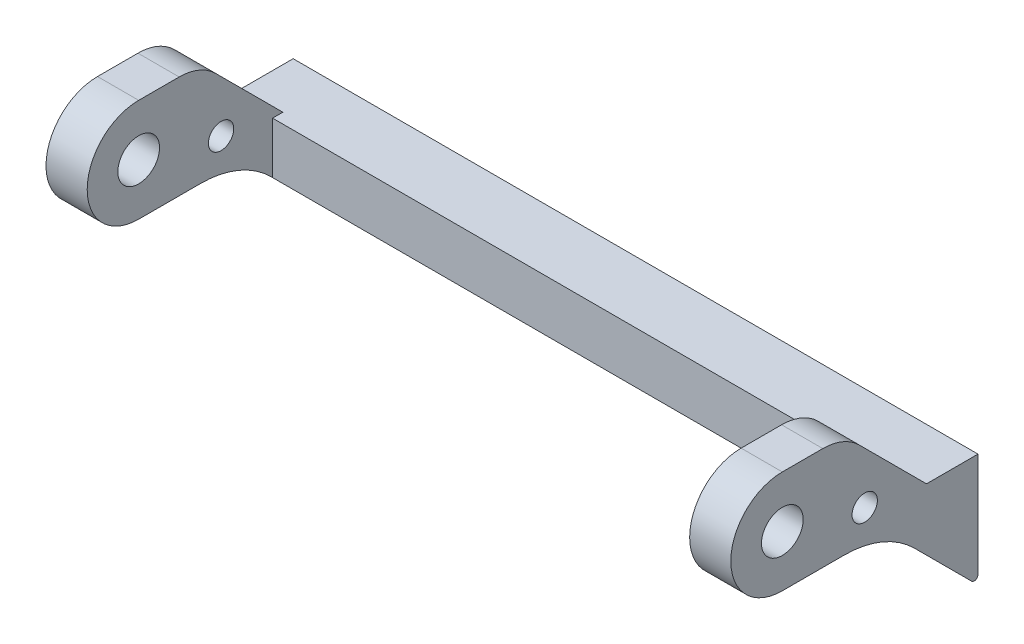
ISO-10303-21;
HEADER;
FILE_DESCRIPTION(('STEP AP214'),'2;1');
FILE_NAME('part.step','',(''),(''),'','','');
FILE_SCHEMA(('AUTOMOTIVE_DESIGN { 1 0 10303 214 1 1 1 1 }'));
ENDSEC;
DATA;
#1=APPLICATION_CONTEXT('core data for automotive mechanical design processes');
#2=APPLICATION_PROTOCOL_DEFINITION('international standard','automotive_design',2000,#1);
#3=PRODUCT_CONTEXT('',#1,'mechanical');
#4=PRODUCT('Part','Part','',(#3));
#5=PRODUCT_RELATED_PRODUCT_CATEGORY('part','',(#4));
#6=PRODUCT_DEFINITION_FORMATION('','',#4);
#7=PRODUCT_DEFINITION_CONTEXT('part definition',#1,'design');
#8=PRODUCT_DEFINITION('design','',#6,#7);
#9=PRODUCT_DEFINITION_SHAPE('','',#8);
#10=(LENGTH_UNIT() NAMED_UNIT(*) SI_UNIT(.MILLI.,.METRE.));
#11=(NAMED_UNIT(*) PLANE_ANGLE_UNIT() SI_UNIT($,.RADIAN.));
#12=(NAMED_UNIT(*) SI_UNIT($,.STERADIAN.) SOLID_ANGLE_UNIT());
#13=UNCERTAINTY_MEASURE_WITH_UNIT(LENGTH_MEASURE(1.E-05),#10,'distance_accuracy_value','');
#14=(GEOMETRIC_REPRESENTATION_CONTEXT(3) GLOBAL_UNCERTAINTY_ASSIGNED_CONTEXT((#13)) GLOBAL_UNIT_ASSIGNED_CONTEXT((#10,
#11,#12)) REPRESENTATION_CONTEXT('',''));
#15=CARTESIAN_POINT('',(0.,0.,0.));
#16=DIRECTION('',(0.,0.,1.));
#17=DIRECTION('',(1.,0.,0.));
#18=AXIS2_PLACEMENT_3D('',#15,#16,#17);
#19=CARTESIAN_POINT('',(0.,-11.1308831175457,-10.64));
#20=DIRECTION('',(1.,0.,0.));
#21=DIRECTION('',(0.,0.,-1.));
#22=AXIS2_PLACEMENT_3D('',#19,#20,#21);
#23=PLANE('',#22);
#24=CARTESIAN_POINT('',(0.,2.,8.));
#25=DIRECTION('',(1.,0.,0.));
#26=DIRECTION('',(0.,0.,-1.));
#27=AXIS2_PLACEMENT_3D('',#24,#25,#26);
#28=CIRCLE('',#27,2.025);
#29=CARTESIAN_POINT('',(0.,2.,5.975));
#30=VERTEX_POINT('',#29);
#31=EDGE_CURVE('E285',#30,#30,#28,.T.);
#32=ORIENTED_EDGE('',*,*,#31,.T.);
#33=EDGE_LOOP('',(#32));
#34=FACE_BOUND('',#33,.T.);
#35=CARTESIAN_POINT('',(0.,0.,0.));
#36=DIRECTION('',(1.,0.,0.));
#37=DIRECTION('',(0.,0.,-1.));
#38=AXIS2_PLACEMENT_3D('',#35,#36,#37);
#39=CIRCLE('',#38,1.2295);
#40=CARTESIAN_POINT('',(0.,0.,-1.2295));
#41=VERTEX_POINT('',#40);
#42=EDGE_CURVE('E287',#41,#41,#39,.T.);
#43=ORIENTED_EDGE('',*,*,#42,.T.);
#44=EDGE_LOOP('',(#43));
#45=FACE_BOUND('',#44,.T.);
#46=DIRECTION('',(0.,0.,-1.));
#47=VECTOR('',#46,1.);
#48=CARTESIAN_POINT('',(0.,-1.,-6.));
#49=LINE('',#48,#47);
#50=CARTESIAN_POINT('',(0.,-1.,-5.));
#51=VERTEX_POINT('',#50);
#52=CARTESIAN_POINT('',(0.,-1.,-6.));
#53=VERTEX_POINT('',#52);
#54=EDGE_CURVE('E275',#51,#53,#49,.T.);
#55=ORIENTED_EDGE('',*,*,#54,.F.);
#56=DIRECTION('',(0.,1.,0.));
#57=VECTOR('',#56,1.);
#58=CARTESIAN_POINT('',(0.,-1.,-5.));
#59=LINE('',#58,#57);
#60=CARTESIAN_POINT('',(0.,-6.,-5.));
#61=VERTEX_POINT('',#60);
#62=EDGE_CURVE('E74',#61,#51,#59,.T.);
#63=ORIENTED_EDGE('',*,*,#62,.F.);
#64=DIRECTION('',(0.,-0.707106781186547,-0.707106781186548));
#65=VECTOR('',#64,1.);
#66=CARTESIAN_POINT('',(0.,-11.3854415587729,-10.3854415587729));
#67=LINE('',#66,#65);
#68=CARTESIAN_POINT('',(0.,-5.82842712474619,-4.8284271247462));
#69=VERTEX_POINT('',#68);
#70=EDGE_CURVE('E300',#69,#61,#67,.T.);
#71=ORIENTED_EDGE('',*,*,#70,.F.);
#72=CARTESIAN_POINT('',(0.,-12.6568542494924,2.));
#73=DIRECTION('',(-1.,0.,0.));
#74=DIRECTION('',(0.,0.,-1.));
#75=AXIS2_PLACEMENT_3D('',#72,#73,#74);
#76=CIRCLE('',#75,9.6568542494924);
#77=CARTESIAN_POINT('',(0.,-3.,2.));
#78=VERTEX_POINT('',#77);
#79=EDGE_CURVE('E323',#78,#69,#76,.T.);
#80=ORIENTED_EDGE('',*,*,#79,.F.);
#81=DIRECTION('',(0.,0.,-1.));
#82=VECTOR('',#81,1.);
#83=CARTESIAN_POINT('',(0.,-3.,8.));
#84=LINE('',#83,#82);
#85=CARTESIAN_POINT('',(0.,-3.,8.));
#86=VERTEX_POINT('',#85);
#87=EDGE_CURVE('E321',#86,#78,#84,.T.);
#88=ORIENTED_EDGE('',*,*,#87,.F.);
#89=CARTESIAN_POINT('',(0.,2.,8.));
#90=DIRECTION('',(1.,0.,0.));
#91=DIRECTION('',(0.,0.,-1.));
#92=AXIS2_PLACEMENT_3D('',#89,#90,#91);
#93=CIRCLE('',#92,5.);
#94=CARTESIAN_POINT('',(0.,7.,8.));
#95=VERTEX_POINT('',#94);
#96=EDGE_CURVE('E317',#95,#86,#93,.T.);
#97=ORIENTED_EDGE('',*,*,#96,.F.);
#98=DIRECTION('',(0.,0.,1.));
#99=VECTOR('',#98,1.);
#100=CARTESIAN_POINT('',(0.,7.,8.));
#101=LINE('',#100,#99);
#102=CARTESIAN_POINT('',(0.,7.,4.0710678118655));
#103=VERTEX_POINT('',#102);
#104=EDGE_CURVE('E320',#103,#95,#101,.T.);
#105=ORIENTED_EDGE('',*,*,#104,.F.);
#106=CARTESIAN_POINT('',(0.,2.,4.0710678118655));
#107=DIRECTION('',(1.,0.,0.));
#108=DIRECTION('',(0.,0.,-1.));
#109=AXIS2_PLACEMENT_3D('',#106,#107,#108);
#110=CIRCLE('',#109,5.00000000000001);
#111=CARTESIAN_POINT('',(0.,5.53553390593274,0.535533905932757));
#112=VERTEX_POINT('',#111);
#113=EDGE_CURVE('E312',#112,#103,#110,.T.);
#114=ORIENTED_EDGE('',*,*,#113,.F.);
#115=DIRECTION('',(0.,0.707106781186547,0.707106781186548));
#116=VECTOR('',#115,1.);
#117=CARTESIAN_POINT('',(0.,5.53553390593275,0.535533905932752));
#118=LINE('',#117,#116);
#119=EDGE_CURVE('E295',#53,#112,#118,.T.);
#120=ORIENTED_EDGE('',*,*,#119,.F.);
#121=EDGE_LOOP('',(#55,#63,#71,#80,#88,#97,#105,#114,#120));
#122=FACE_BOUND('',#121,.T.);
#123=ADVANCED_FACE('F51',(#34,#45,#122),#23,.F.);
#124=CARTESIAN_POINT('',(4.,-11.1308831175457,-10.64));
#125=DIRECTION('',(1.,0.,0.));
#126=DIRECTION('',(0.,0.,-1.));
#127=AXIS2_PLACEMENT_3D('',#124,#125,#126);
#128=PLANE('',#127);
#129=CARTESIAN_POINT('',(4.,0.,0.));
#130=DIRECTION('',(1.,0.,0.));
#131=DIRECTION('',(0.,0.,-1.));
#132=AXIS2_PLACEMENT_3D('',#129,#130,#131);
#133=CIRCLE('',#132,1.2295);
#134=CARTESIAN_POINT('',(4.,0.,-1.2295));
#135=VERTEX_POINT('',#134);
#136=EDGE_CURVE('E289',#135,#135,#133,.T.);
#137=ORIENTED_EDGE('',*,*,#136,.F.);
#138=EDGE_LOOP('',(#137));
#139=FACE_BOUND('',#138,.T.);
#140=CARTESIAN_POINT('',(4.,-11.1308831175457,-10.64));
#141=DIRECTION('',(1.,0.,0.));
#142=DIRECTION('',(0.,0.,-1.));
#143=AXIS2_PLACEMENT_3D('',#140,#141,#142);
#144=CIRCLE('',#143,0.359999999999993);
#145=CARTESIAN_POINT('',(4.,-11.3854415587729,-10.3854415587729));
#146=VERTEX_POINT('',#145);
#147=CARTESIAN_POINT('',(4.,-11.1308831175457,-11.));
#148=VERTEX_POINT('',#147);
#149=EDGE_CURVE('E192',#146,#148,#144,.T.);
#150=ORIENTED_EDGE('',*,*,#149,.T.);
#151=DIRECTION('',(0.,1.,0.));
#152=VECTOR('',#151,1.);
#153=CARTESIAN_POINT('',(4.,-11.1308831175457,-11.));
#154=LINE('',#153,#152);
#155=CARTESIAN_POINT('',(4.,-1.,-11.));
#156=VERTEX_POINT('',#155);
#157=EDGE_CURVE('E297',#148,#156,#154,.T.);
#158=ORIENTED_EDGE('',*,*,#157,.T.);
#159=DIRECTION('',(0.,0.,1.));
#160=VECTOR('',#159,1.);
#161=CARTESIAN_POINT('',(4.,-1.,-11.));
#162=LINE('',#161,#160);
#163=CARTESIAN_POINT('',(4.,-1.,-6.));
#164=VERTEX_POINT('',#163);
#165=EDGE_CURVE('E299',#156,#164,#162,.T.);
#166=ORIENTED_EDGE('',*,*,#165,.T.);
#167=DIRECTION('',(0.,0.707106781186547,0.707106781186548));
#168=VECTOR('',#167,1.);
#169=CARTESIAN_POINT('',(4.,5.53553390593275,0.535533905932752));
#170=LINE('',#169,#168);
#171=CARTESIAN_POINT('',(4.,5.53553390593274,0.535533905932757));
#172=VERTEX_POINT('',#171);
#173=EDGE_CURVE('E302',#164,#172,#170,.T.);
#174=ORIENTED_EDGE('',*,*,#173,.T.);
#175=CARTESIAN_POINT('',(4.,2.,4.0710678118655));
#176=DIRECTION('',(1.,0.,0.));
#177=DIRECTION('',(0.,0.,-1.));
#178=AXIS2_PLACEMENT_3D('',#175,#176,#177);
#179=CIRCLE('',#178,5.00000000000001);
#180=CARTESIAN_POINT('',(4.,7.,4.0710678118655));
#181=VERTEX_POINT('',#180);
#182=EDGE_CURVE('E303',#172,#181,#179,.T.);
#183=ORIENTED_EDGE('',*,*,#182,.T.);
#184=DIRECTION('',(0.,0.,1.));
#185=VECTOR('',#184,1.);
#186=CARTESIAN_POINT('',(4.,7.,8.));
#187=LINE('',#186,#185);
#188=CARTESIAN_POINT('',(4.,7.,8.));
#189=VERTEX_POINT('',#188);
#190=EDGE_CURVE('E301',#181,#189,#187,.T.);
#191=ORIENTED_EDGE('',*,*,#190,.T.);
#192=CARTESIAN_POINT('',(4.,2.,8.));
#193=DIRECTION('',(1.,0.,0.));
#194=DIRECTION('',(0.,0.,-1.));
#195=AXIS2_PLACEMENT_3D('',#192,#193,#194);
#196=CIRCLE('',#195,5.);
#197=CARTESIAN_POINT('',(4.,-3.,8.));
#198=VERTEX_POINT('',#197);
#199=EDGE_CURVE('E307',#189,#198,#196,.T.);
#200=ORIENTED_EDGE('',*,*,#199,.T.);
#201=DIRECTION('',(0.,0.,-1.));
#202=VECTOR('',#201,1.);
#203=CARTESIAN_POINT('',(4.,-3.,8.));
#204=LINE('',#203,#202);
#205=CARTESIAN_POINT('',(4.,-3.,2.));
#206=VERTEX_POINT('',#205);
#207=EDGE_CURVE('E310',#198,#206,#204,.T.);
#208=ORIENTED_EDGE('',*,*,#207,.T.);
#209=CARTESIAN_POINT('',(4.,-12.6568542494924,2.));
#210=DIRECTION('',(-1.,0.,0.));
#211=DIRECTION('',(0.,0.,-1.));
#212=AXIS2_PLACEMENT_3D('',#209,#210,#211);
#213=CIRCLE('',#212,9.6568542494924);
#214=CARTESIAN_POINT('',(4.,-5.82842712474619,-4.8284271247462));
#215=VERTEX_POINT('',#214);
#216=EDGE_CURVE('E313',#206,#215,#213,.T.);
#217=ORIENTED_EDGE('',*,*,#216,.T.);
#218=DIRECTION('',(0.,-0.707106781186547,-0.707106781186548));
#219=VECTOR('',#218,1.);
#220=CARTESIAN_POINT('',(4.,-11.3854415587729,-10.3854415587729));
#221=LINE('',#220,#219);
#222=EDGE_CURVE('E198',#215,#146,#221,.T.);
#223=ORIENTED_EDGE('',*,*,#222,.T.);
#224=EDGE_LOOP('',(#150,#158,#166,#174,#183,#191,#200,#208,#217,#223));
#225=FACE_BOUND('',#224,.T.);
#226=CARTESIAN_POINT('',(4.,2.,8.));
#227=DIRECTION('',(1.,0.,0.));
#228=DIRECTION('',(0.,0.,-1.));
#229=AXIS2_PLACEMENT_3D('',#226,#227,#228);
#230=CIRCLE('',#229,2.025);
#231=CARTESIAN_POINT('',(4.,2.,5.975));
#232=VERTEX_POINT('',#231);
#233=EDGE_CURVE('E283',#232,#232,#230,.T.);
#234=ORIENTED_EDGE('',*,*,#233,.F.);
#235=EDGE_LOOP('',(#234));
#236=FACE_BOUND('',#235,.T.);
#237=ADVANCED_FACE('F354',(#139,#225,#236),#128,.T.);
#238=CARTESIAN_POINT('',(4.,-11.1308831175457,-10.64));
#239=DIRECTION('',(-1.,0.,0.));
#240=DIRECTION('',(0.,0.,1.));
#241=AXIS2_PLACEMENT_3D('',#238,#239,#240);
#242=CYLINDRICAL_SURFACE('',#241,0.359999999999993);
#243=DIRECTION('',(-1.,0.,0.));
#244=VECTOR('',#243,1.);
#245=CARTESIAN_POINT('',(4.,-11.3854415587729,-10.3854415587729));
#246=LINE('',#245,#244);
#247=CARTESIAN_POINT('',(-62.5,-11.3854415587729,-10.3854415587729));
#248=VERTEX_POINT('',#247);
#249=EDGE_CURVE('E183',#146,#248,#246,.T.);
#250=ORIENTED_EDGE('',*,*,#249,.T.);
#251=CARTESIAN_POINT('',(-62.5,-11.1308831175457,-10.64));
#252=DIRECTION('',(1.,0.,0.));
#253=DIRECTION('',(0.,0.,-1.));
#254=AXIS2_PLACEMENT_3D('',#251,#252,#253);
#255=CIRCLE('',#254,0.359999999999993);
#256=CARTESIAN_POINT('',(-62.5,-11.1308831175457,-11.));
#257=VERTEX_POINT('',#256);
#258=EDGE_CURVE('E188',#248,#257,#255,.T.);
#259=ORIENTED_EDGE('',*,*,#258,.T.);
#260=DIRECTION('',(-1.,0.,0.));
#261=VECTOR('',#260,1.);
#262=CARTESIAN_POINT('',(4.,-11.1308831175457,-11.));
#263=LINE('',#262,#261);
#264=EDGE_CURVE('E13',#148,#257,#263,.T.);
#265=ORIENTED_EDGE('',*,*,#264,.F.);
#266=ORIENTED_EDGE('',*,*,#149,.F.);
#267=EDGE_LOOP('',(#250,#259,#265,#266));
#268=FACE_BOUND('',#267,.T.);
#269=ADVANCED_FACE('F52',(#268),#242,.T.);
#270=CARTESIAN_POINT('',(4.,-11.1308831175457,-11.));
#271=DIRECTION('',(0.,0.,1.));
#272=DIRECTION('',(1.,0.,0.));
#273=AXIS2_PLACEMENT_3D('',#270,#271,#272);
#274=PLANE('',#273);
#275=ORIENTED_EDGE('',*,*,#264,.T.);
#276=DIRECTION('',(0.,1.,0.));
#277=VECTOR('',#276,1.);
#278=CARTESIAN_POINT('',(-62.5,-11.1308831175457,-11.));
#279=LINE('',#278,#277);
#280=CARTESIAN_POINT('',(-62.5,-1.,-11.));
#281=VERTEX_POINT('',#280);
#282=EDGE_CURVE('E206',#257,#281,#279,.T.);
#283=ORIENTED_EDGE('',*,*,#282,.T.);
#284=DIRECTION('',(-1.,0.,0.));
#285=VECTOR('',#284,1.);
#286=CARTESIAN_POINT('',(4.,-1.,-11.));
#287=LINE('',#286,#285);
#288=EDGE_CURVE('E56',#156,#281,#287,.T.);
#289=ORIENTED_EDGE('',*,*,#288,.F.);
#290=ORIENTED_EDGE('',*,*,#157,.F.);
#291=EDGE_LOOP('',(#275,#283,#289,#290));
#292=FACE_BOUND('',#291,.T.);
#293=ADVANCED_FACE('F355',(#292),#274,.F.);
#294=CARTESIAN_POINT('',(4.,-1.,-11.));
#295=DIRECTION('',(0.,-1.,0.));
#296=DIRECTION('',(0.,0.,-1.));
#297=AXIS2_PLACEMENT_3D('',#294,#295,#296);
#298=PLANE('',#297);
#299=ORIENTED_EDGE('',*,*,#288,.T.);
#300=DIRECTION('',(0.,0.,1.));
#301=VECTOR('',#300,1.);
#302=CARTESIAN_POINT('',(-62.5,-1.,-11.));
#303=LINE('',#302,#301);
#304=CARTESIAN_POINT('',(-62.5,-1.,-6.));
#305=VERTEX_POINT('',#304);
#306=EDGE_CURVE('E235',#281,#305,#303,.T.);
#307=ORIENTED_EDGE('',*,*,#306,.T.);
#308=DIRECTION('',(1.,0.,0.));
#309=VECTOR('',#308,1.);
#310=CARTESIAN_POINT('',(-62.5,-1.,-6.));
#311=LINE('',#310,#309);
#312=CARTESIAN_POINT('',(-58.5,-1.,-6.));
#313=VERTEX_POINT('',#312);
#314=EDGE_CURVE('E237',#305,#313,#311,.T.);
#315=ORIENTED_EDGE('',*,*,#314,.T.);
#316=DIRECTION('',(0.,0.,-1.));
#317=VECTOR('',#316,1.);
#318=CARTESIAN_POINT('',(-58.5,-1.,-6.));
#319=LINE('',#318,#317);
#320=CARTESIAN_POINT('',(-58.5,-1.,-5.));
#321=VERTEX_POINT('',#320);
#322=EDGE_CURVE('E67',#321,#313,#319,.T.);
#323=ORIENTED_EDGE('',*,*,#322,.F.);
#324=DIRECTION('',(1.,0.,0.));
#325=VECTOR('',#324,1.);
#326=CARTESIAN_POINT('',(-29.25,-1.,-5.));
#327=LINE('',#326,#325);
#328=EDGE_CURVE('E277',#321,#51,#327,.T.);
#329=ORIENTED_EDGE('',*,*,#328,.T.);
#330=ORIENTED_EDGE('',*,*,#54,.T.);
#331=DIRECTION('',(-1.,0.,0.));
#332=VECTOR('',#331,1.);
#333=CARTESIAN_POINT('',(4.,-1.,-6.));
#334=LINE('',#333,#332);
#335=EDGE_CURVE('E343',#164,#53,#334,.T.);
#336=ORIENTED_EDGE('',*,*,#335,.F.);
#337=ORIENTED_EDGE('',*,*,#165,.F.);
#338=EDGE_LOOP('',(#299,#307,#315,#323,#329,#330,#336,#337));
#339=FACE_BOUND('',#338,.T.);
#340=ADVANCED_FACE('F350',(#339),#298,.F.);
#341=CARTESIAN_POINT('',(4.,5.53553390593275,0.535533905932752));
#342=DIRECTION('',(0.,-0.707106781186548,0.707106781186547));
#343=DIRECTION('',(0.,-0.707106781186547,-0.707106781186548));
#344=AXIS2_PLACEMENT_3D('',#341,#342,#343);
#345=PLANE('',#344);
#346=ORIENTED_EDGE('',*,*,#119,.T.);
#347=DIRECTION('',(-1.,0.,0.));
#348=VECTOR('',#347,1.);
#349=CARTESIAN_POINT('',(4.,5.53553390593274,0.535533905932757));
#350=LINE('',#349,#348);
#351=EDGE_CURVE('E336',#172,#112,#350,.T.);
#352=ORIENTED_EDGE('',*,*,#351,.F.);
#353=ORIENTED_EDGE('',*,*,#173,.F.);
#354=ORIENTED_EDGE('',*,*,#335,.T.);
#355=EDGE_LOOP('',(#346,#352,#353,#354));
#356=FACE_BOUND('',#355,.T.);
#357=ADVANCED_FACE('F384',(#356),#345,.F.);
#358=CARTESIAN_POINT('',(4.,2.,4.0710678118655));
#359=DIRECTION('',(-1.,0.,0.));
#360=DIRECTION('',(0.,0.,1.));
#361=AXIS2_PLACEMENT_3D('',#358,#359,#360);
#362=CYLINDRICAL_SURFACE('',#361,5.00000000000001);
#363=ORIENTED_EDGE('',*,*,#113,.T.);
#364=DIRECTION('',(-1.,0.,0.));
#365=VECTOR('',#364,1.);
#366=CARTESIAN_POINT('',(4.,7.,4.0710678118655));
#367=LINE('',#366,#365);
#368=EDGE_CURVE('E340',#181,#103,#367,.T.);
#369=ORIENTED_EDGE('',*,*,#368,.F.);
#370=ORIENTED_EDGE('',*,*,#182,.F.);
#371=ORIENTED_EDGE('',*,*,#351,.T.);
#372=EDGE_LOOP('',(#363,#369,#370,#371));
#373=FACE_BOUND('',#372,.T.);
#374=ADVANCED_FACE('F381',(#373),#362,.T.);
#375=CARTESIAN_POINT('',(4.,7.,8.));
#376=DIRECTION('',(0.,-1.,0.));
#377=DIRECTION('',(0.,0.,-1.));
#378=AXIS2_PLACEMENT_3D('',#375,#376,#377);
#379=PLANE('',#378);
#380=ORIENTED_EDGE('',*,*,#104,.T.);
#381=DIRECTION('',(-1.,0.,0.));
#382=VECTOR('',#381,1.);
#383=CARTESIAN_POINT('',(4.,7.,8.));
#384=LINE('',#383,#382);
#385=EDGE_CURVE('E331',#189,#95,#384,.T.);
#386=ORIENTED_EDGE('',*,*,#385,.F.);
#387=ORIENTED_EDGE('',*,*,#190,.F.);
#388=ORIENTED_EDGE('',*,*,#368,.T.);
#389=EDGE_LOOP('',(#380,#386,#387,#388));
#390=FACE_BOUND('',#389,.T.);
#391=ADVANCED_FACE('F376',(#390),#379,.F.);
#392=CARTESIAN_POINT('',(4.,2.,8.));
#393=DIRECTION('',(-1.,0.,0.));
#394=DIRECTION('',(0.,0.,1.));
#395=AXIS2_PLACEMENT_3D('',#392,#393,#394);
#396=CYLINDRICAL_SURFACE('',#395,5.);
#397=ORIENTED_EDGE('',*,*,#96,.T.);
#398=DIRECTION('',(-1.,0.,0.));
#399=VECTOR('',#398,1.);
#400=CARTESIAN_POINT('',(4.,-3.,8.));
#401=LINE('',#400,#399);
#402=EDGE_CURVE('E332',#198,#86,#401,.T.);
#403=ORIENTED_EDGE('',*,*,#402,.F.);
#404=ORIENTED_EDGE('',*,*,#199,.F.);
#405=ORIENTED_EDGE('',*,*,#385,.T.);
#406=EDGE_LOOP('',(#397,#403,#404,#405));
#407=FACE_BOUND('',#406,.T.);
#408=ADVANCED_FACE('F367',(#407),#396,.T.);
#409=CARTESIAN_POINT('',(4.,-3.,8.));
#410=DIRECTION('',(0.,1.,0.));
#411=DIRECTION('',(0.,0.,1.));
#412=AXIS2_PLACEMENT_3D('',#409,#410,#411);
#413=PLANE('',#412);
#414=ORIENTED_EDGE('',*,*,#87,.T.);
#415=DIRECTION('',(-1.,0.,0.));
#416=VECTOR('',#415,1.);
#417=CARTESIAN_POINT('',(4.,-3.,2.));
#418=LINE('',#417,#416);
#419=EDGE_CURVE('E327',#206,#78,#418,.T.);
#420=ORIENTED_EDGE('',*,*,#419,.F.);
#421=ORIENTED_EDGE('',*,*,#207,.F.);
#422=ORIENTED_EDGE('',*,*,#402,.T.);
#423=EDGE_LOOP('',(#414,#420,#421,#422));
#424=FACE_BOUND('',#423,.T.);
#425=ADVANCED_FACE('F368',(#424),#413,.F.);
#426=CARTESIAN_POINT('',(4.,-12.6568542494924,2.));
#427=DIRECTION('',(-1.,0.,0.));
#428=DIRECTION('',(0.,0.,1.));
#429=AXIS2_PLACEMENT_3D('',#426,#427,#428);
#430=CYLINDRICAL_SURFACE('',#429,9.6568542494924);
#431=ORIENTED_EDGE('',*,*,#79,.T.);
#432=DIRECTION('',(-1.,0.,0.));
#433=VECTOR('',#432,1.);
#434=CARTESIAN_POINT('',(4.,-5.82842712474619,-4.8284271247462));
#435=LINE('',#434,#433);
#436=EDGE_CURVE('E191',#215,#69,#435,.T.);
#437=ORIENTED_EDGE('',*,*,#436,.F.);
#438=ORIENTED_EDGE('',*,*,#216,.F.);
#439=ORIENTED_EDGE('',*,*,#419,.T.);
#440=EDGE_LOOP('',(#431,#437,#438,#439));
#441=FACE_BOUND('',#440,.T.);
#442=ADVANCED_FACE('F362',(#441),#430,.F.);
#443=CARTESIAN_POINT('',(4.,-11.3854415587729,-10.3854415587729));
#444=DIRECTION('',(0.,0.707106781186548,-0.707106781186547));
#445=DIRECTION('',(0.,0.707106781186547,0.707106781186548));
#446=AXIS2_PLACEMENT_3D('',#443,#444,#445);
#447=PLANE('',#446);
#448=ORIENTED_EDGE('',*,*,#70,.T.);
#449=DIRECTION('',(1.,0.,0.));
#450=VECTOR('',#449,1.);
#451=CARTESIAN_POINT('',(-29.25,-5.99999999999999,-5.));
#452=LINE('',#451,#450);
#453=CARTESIAN_POINT('',(-58.5,-5.99999999999999,-5.));
#454=VERTEX_POINT('',#453);
#455=EDGE_CURVE('E276',#454,#61,#452,.T.);
#456=ORIENTED_EDGE('',*,*,#455,.F.);
#457=DIRECTION('',(0.,-0.707106781186547,-0.707106781186548));
#458=VECTOR('',#457,1.);
#459=CARTESIAN_POINT('',(-58.5,-11.3854415587729,-10.3854415587729));
#460=LINE('',#459,#458);
#461=CARTESIAN_POINT('',(-58.5,-5.82842712474619,-4.8284271247462));
#462=VERTEX_POINT('',#461);
#463=EDGE_CURVE('E240',#462,#454,#460,.T.);
#464=ORIENTED_EDGE('',*,*,#463,.F.);
#465=DIRECTION('',(1.,0.,0.));
#466=VECTOR('',#465,1.);
#467=CARTESIAN_POINT('',(-62.5,-5.82842712474619,-4.8284271247462));
#468=LINE('',#467,#466);
#469=CARTESIAN_POINT('',(-62.5,-5.82842712474619,-4.8284271247462));
#470=VERTEX_POINT('',#469);
#471=EDGE_CURVE('E211',#470,#462,#468,.T.);
#472=ORIENTED_EDGE('',*,*,#471,.F.);
#473=DIRECTION('',(0.,-0.707106781186547,-0.707106781186548));
#474=VECTOR('',#473,1.);
#475=CARTESIAN_POINT('',(-62.5,-11.3854415587729,-10.3854415587729));
#476=LINE('',#475,#474);
#477=EDGE_CURVE('E205',#470,#248,#476,.T.);
#478=ORIENTED_EDGE('',*,*,#477,.T.);
#479=ORIENTED_EDGE('',*,*,#249,.F.);
#480=ORIENTED_EDGE('',*,*,#222,.F.);
#481=ORIENTED_EDGE('',*,*,#436,.T.);
#482=EDGE_LOOP('',(#448,#456,#464,#472,#478,#479,#480,#481));
#483=FACE_BOUND('',#482,.T.);
#484=ADVANCED_FACE('F207',(#483),#447,.F.);
#485=CARTESIAN_POINT('',(4.,0.,0.));
#486=DIRECTION('',(-1.,0.,0.));
#487=DIRECTION('',(0.,0.,1.));
#488=AXIS2_PLACEMENT_3D('',#485,#486,#487);
#489=CYLINDRICAL_SURFACE('',#488,1.2295);
#490=ORIENTED_EDGE('',*,*,#136,.T.);
#491=EDGE_LOOP('',(#490));
#492=FACE_BOUND('',#491,.T.);
#493=ORIENTED_EDGE('',*,*,#42,.F.);
#494=EDGE_LOOP('',(#493));
#495=FACE_BOUND('',#494,.T.);
#496=ADVANCED_FACE('F440',(#492,#495),#489,.F.);
#497=CARTESIAN_POINT('',(4.,2.,8.));
#498=DIRECTION('',(-1.,0.,0.));
#499=DIRECTION('',(0.,0.,1.));
#500=AXIS2_PLACEMENT_3D('',#497,#498,#499);
#501=CYLINDRICAL_SURFACE('',#500,2.025);
#502=ORIENTED_EDGE('',*,*,#233,.T.);
#503=EDGE_LOOP('',(#502));
#504=FACE_BOUND('',#503,.T.);
#505=ORIENTED_EDGE('',*,*,#31,.F.);
#506=EDGE_LOOP('',(#505));
#507=FACE_BOUND('',#506,.T.);
#508=ADVANCED_FACE('F518',(#504,#507),#501,.F.);
#509=CARTESIAN_POINT('',(-29.25,-1.,-5.));
#510=DIRECTION('',(0.,0.,-1.));
#511=DIRECTION('',(-1.,0.,0.));
#512=AXIS2_PLACEMENT_3D('',#509,#510,#511);
#513=PLANE('',#512);
#514=ORIENTED_EDGE('',*,*,#62,.T.);
#515=ORIENTED_EDGE('',*,*,#328,.F.);
#516=DIRECTION('',(0.,1.,0.));
#517=VECTOR('',#516,1.);
#518=CARTESIAN_POINT('',(-58.5,-1.,-5.));
#519=LINE('',#518,#517);
#520=EDGE_CURVE('E267',#454,#321,#519,.T.);
#521=ORIENTED_EDGE('',*,*,#520,.F.);
#522=ORIENTED_EDGE('',*,*,#455,.T.);
#523=EDGE_LOOP('',(#514,#515,#521,#522));
#524=FACE_BOUND('',#523,.T.);
#525=ADVANCED_FACE('F389',(#524),#513,.F.);
#526=CARTESIAN_POINT('',(-58.5,-11.1308831175457,-10.64));
#527=DIRECTION('',(-1.,0.,0.));
#528=DIRECTION('',(0.,0.,-1.));
#529=AXIS2_PLACEMENT_3D('',#526,#527,#528);
#530=PLANE('',#529);
#531=CARTESIAN_POINT('',(-58.5,2.,8.));
#532=DIRECTION('',(1.,0.,0.));
#533=DIRECTION('',(0.,0.,-1.));
#534=AXIS2_PLACEMENT_3D('',#531,#532,#533);
#535=CIRCLE('',#534,2.025);
#536=CARTESIAN_POINT('',(-58.5,2.,5.975));
#537=VERTEX_POINT('',#536);
#538=EDGE_CURVE('E665',#537,#537,#535,.T.);
#539=ORIENTED_EDGE('',*,*,#538,.F.);
#540=EDGE_LOOP('',(#539));
#541=FACE_BOUND('',#540,.T.);
#542=CARTESIAN_POINT('',(-58.5,0.,0.));
#543=DIRECTION('',(1.,0.,0.));
#544=DIRECTION('',(0.,0.,-1.));
#545=AXIS2_PLACEMENT_3D('',#542,#543,#544);
#546=CIRCLE('',#545,1.2295);
#547=CARTESIAN_POINT('',(-58.5,0.,-1.2295));
#548=VERTEX_POINT('',#547);
#549=EDGE_CURVE('E661',#548,#548,#546,.T.);
#550=ORIENTED_EDGE('',*,*,#549,.F.);
#551=EDGE_LOOP('',(#550));
#552=FACE_BOUND('',#551,.T.);
#553=ORIENTED_EDGE('',*,*,#463,.T.);
#554=ORIENTED_EDGE('',*,*,#520,.T.);
#555=ORIENTED_EDGE('',*,*,#322,.T.);
#556=DIRECTION('',(0.,0.707106781186547,0.707106781186548));
#557=VECTOR('',#556,1.);
#558=CARTESIAN_POINT('',(-58.5,5.53553390593275,0.535533905932752));
#559=LINE('',#558,#557);
#560=CARTESIAN_POINT('',(-58.5,5.53553390593274,0.535533905932757));
#561=VERTEX_POINT('',#560);
#562=EDGE_CURVE('E210',#313,#561,#559,.T.);
#563=ORIENTED_EDGE('',*,*,#562,.T.);
#564=CARTESIAN_POINT('',(-58.5,2.,4.0710678118655));
#565=DIRECTION('',(1.,0.,0.));
#566=DIRECTION('',(0.,0.,-1.));
#567=AXIS2_PLACEMENT_3D('',#564,#565,#566);
#568=CIRCLE('',#567,5.00000000000001);
#569=CARTESIAN_POINT('',(-58.5,7.,4.0710678118655));
#570=VERTEX_POINT('',#569);
#571=EDGE_CURVE('E251',#561,#570,#568,.T.);
#572=ORIENTED_EDGE('',*,*,#571,.T.);
#573=DIRECTION('',(0.,0.,1.));
#574=VECTOR('',#573,1.);
#575=CARTESIAN_POINT('',(-58.5,7.,8.));
#576=LINE('',#575,#574);
#577=CARTESIAN_POINT('',(-58.5,7.,8.));
#578=VERTEX_POINT('',#577);
#579=EDGE_CURVE('E246',#570,#578,#576,.T.);
#580=ORIENTED_EDGE('',*,*,#579,.T.);
#581=CARTESIAN_POINT('',(-58.5,2.,8.));
#582=DIRECTION('',(1.,0.,0.));
#583=DIRECTION('',(0.,0.,-1.));
#584=AXIS2_PLACEMENT_3D('',#581,#582,#583);
#585=CIRCLE('',#584,5.);
#586=CARTESIAN_POINT('',(-58.5,-3.,8.));
#587=VERTEX_POINT('',#586);
#588=EDGE_CURVE('E250',#578,#587,#585,.T.);
#589=ORIENTED_EDGE('',*,*,#588,.T.);
#590=DIRECTION('',(0.,0.,-1.));
#591=VECTOR('',#590,1.);
#592=CARTESIAN_POINT('',(-58.5,-3.,8.));
#593=LINE('',#592,#591);
#594=CARTESIAN_POINT('',(-58.5,-3.,2.));
#595=VERTEX_POINT('',#594);
#596=EDGE_CURVE('E244',#587,#595,#593,.T.);
#597=ORIENTED_EDGE('',*,*,#596,.T.);
#598=CARTESIAN_POINT('',(-58.5,-12.6568542494924,2.));
#599=DIRECTION('',(-1.,0.,0.));
#600=DIRECTION('',(0.,0.,-1.));
#601=AXIS2_PLACEMENT_3D('',#598,#599,#600);
#602=CIRCLE('',#601,9.6568542494924);
#603=EDGE_CURVE('E238',#595,#462,#602,.T.);
#604=ORIENTED_EDGE('',*,*,#603,.T.);
#605=EDGE_LOOP('',(#553,#554,#555,#563,#572,#580,#589,#597,#604));
#606=FACE_BOUND('',#605,.T.);
#607=ADVANCED_FACE('F388',(#541,#552,#606),#530,.F.);
#608=CARTESIAN_POINT('',(-62.5,-12.6568542494924,2.));
#609=DIRECTION('',(1.,0.,0.));
#610=DIRECTION('',(0.,0.,-1.));
#611=AXIS2_PLACEMENT_3D('',#608,#609,#610);
#612=CYLINDRICAL_SURFACE('',#611,9.6568542494924);
#613=ORIENTED_EDGE('',*,*,#603,.F.);
#614=DIRECTION('',(1.,0.,0.));
#615=VECTOR('',#614,1.);
#616=CARTESIAN_POINT('',(-62.5,-3.,2.));
#617=LINE('',#616,#615);
#618=CARTESIAN_POINT('',(-62.5,-3.,2.));
#619=VERTEX_POINT('',#618);
#620=EDGE_CURVE('E266',#619,#595,#617,.T.);
#621=ORIENTED_EDGE('',*,*,#620,.F.);
#622=CARTESIAN_POINT('',(-62.5,-12.6568542494924,2.));
#623=DIRECTION('',(-1.,0.,0.));
#624=DIRECTION('',(0.,0.,-1.));
#625=AXIS2_PLACEMENT_3D('',#622,#623,#624);
#626=CIRCLE('',#625,9.6568542494924);
#627=EDGE_CURVE('E215',#619,#470,#626,.T.);
#628=ORIENTED_EDGE('',*,*,#627,.T.);
#629=ORIENTED_EDGE('',*,*,#471,.T.);
#630=EDGE_LOOP('',(#613,#621,#628,#629));
#631=FACE_BOUND('',#630,.T.);
#632=ADVANCED_FACE('F393',(#631),#612,.F.);
#633=CARTESIAN_POINT('',(-62.5,-3.,8.));
#634=DIRECTION('',(0.,-1.,0.));
#635=DIRECTION('',(0.,0.,-1.));
#636=AXIS2_PLACEMENT_3D('',#633,#634,#635);
#637=PLANE('',#636);
#638=ORIENTED_EDGE('',*,*,#596,.F.);
#639=DIRECTION('',(1.,0.,0.));
#640=VECTOR('',#639,1.);
#641=CARTESIAN_POINT('',(-62.5,-3.,8.));
#642=LINE('',#641,#640);
#643=CARTESIAN_POINT('',(-62.5,-3.,8.));
#644=VERTEX_POINT('',#643);
#645=EDGE_CURVE('E262',#644,#587,#642,.T.);
#646=ORIENTED_EDGE('',*,*,#645,.F.);
#647=DIRECTION('',(0.,0.,-1.));
#648=VECTOR('',#647,1.);
#649=CARTESIAN_POINT('',(-62.5,-3.,8.));
#650=LINE('',#649,#648);
#651=EDGE_CURVE('E212',#644,#619,#650,.T.);
#652=ORIENTED_EDGE('',*,*,#651,.T.);
#653=ORIENTED_EDGE('',*,*,#620,.T.);
#654=EDGE_LOOP('',(#638,#646,#652,#653));
#655=FACE_BOUND('',#654,.T.);
#656=ADVANCED_FACE('F400',(#655),#637,.T.);
#657=CARTESIAN_POINT('',(-62.5,2.,8.));
#658=DIRECTION('',(1.,0.,0.));
#659=DIRECTION('',(0.,0.,-1.));
#660=AXIS2_PLACEMENT_3D('',#657,#658,#659);
#661=CYLINDRICAL_SURFACE('',#660,5.);
#662=ORIENTED_EDGE('',*,*,#588,.F.);
#663=DIRECTION('',(1.,0.,0.));
#664=VECTOR('',#663,1.);
#665=CARTESIAN_POINT('',(-62.5,7.,8.));
#666=LINE('',#665,#664);
#667=CARTESIAN_POINT('',(-62.5,7.,8.));
#668=VERTEX_POINT('',#667);
#669=EDGE_CURVE('E265',#668,#578,#666,.T.);
#670=ORIENTED_EDGE('',*,*,#669,.F.);
#671=CARTESIAN_POINT('',(-62.5,2.,8.));
#672=DIRECTION('',(1.,0.,0.));
#673=DIRECTION('',(0.,0.,-1.));
#674=AXIS2_PLACEMENT_3D('',#671,#672,#673);
#675=CIRCLE('',#674,5.);
#676=EDGE_CURVE('E219',#668,#644,#675,.T.);
#677=ORIENTED_EDGE('',*,*,#676,.T.);
#678=ORIENTED_EDGE('',*,*,#645,.T.);
#679=EDGE_LOOP('',(#662,#670,#677,#678));
#680=FACE_BOUND('',#679,.T.);
#681=ADVANCED_FACE('F396',(#680),#661,.T.);
#682=CARTESIAN_POINT('',(-62.5,7.,8.));
#683=DIRECTION('',(0.,1.,0.));
#684=DIRECTION('',(0.,0.,1.));
#685=AXIS2_PLACEMENT_3D('',#682,#683,#684);
#686=PLANE('',#685);
#687=ORIENTED_EDGE('',*,*,#579,.F.);
#688=DIRECTION('',(1.,0.,0.));
#689=VECTOR('',#688,1.);
#690=CARTESIAN_POINT('',(-62.5,7.,4.0710678118655));
#691=LINE('',#690,#689);
#692=CARTESIAN_POINT('',(-62.5,7.,4.0710678118655));
#693=VERTEX_POINT('',#692);
#694=EDGE_CURVE('E257',#693,#570,#691,.T.);
#695=ORIENTED_EDGE('',*,*,#694,.F.);
#696=DIRECTION('',(0.,0.,1.));
#697=VECTOR('',#696,1.);
#698=CARTESIAN_POINT('',(-62.5,7.,8.));
#699=LINE('',#698,#697);
#700=EDGE_CURVE('E224',#693,#668,#699,.T.);
#701=ORIENTED_EDGE('',*,*,#700,.T.);
#702=ORIENTED_EDGE('',*,*,#669,.T.);
#703=EDGE_LOOP('',(#687,#695,#701,#702));
#704=FACE_BOUND('',#703,.T.);
#705=ADVANCED_FACE('F404',(#704),#686,.T.);
#706=CARTESIAN_POINT('',(-62.5,2.,4.0710678118655));
#707=DIRECTION('',(1.,0.,0.));
#708=DIRECTION('',(0.,0.,-1.));
#709=AXIS2_PLACEMENT_3D('',#706,#707,#708);
#710=CYLINDRICAL_SURFACE('',#709,5.00000000000001);
#711=ORIENTED_EDGE('',*,*,#571,.F.);
#712=DIRECTION('',(1.,0.,0.));
#713=VECTOR('',#712,1.);
#714=CARTESIAN_POINT('',(-62.5,5.53553390593274,0.535533905932757));
#715=LINE('',#714,#713);
#716=CARTESIAN_POINT('',(-62.5,5.53553390593274,0.535533905932757));
#717=VERTEX_POINT('',#716);
#718=EDGE_CURVE('E256',#717,#561,#715,.T.);
#719=ORIENTED_EDGE('',*,*,#718,.F.);
#720=CARTESIAN_POINT('',(-62.5,2.,4.0710678118655));
#721=DIRECTION('',(1.,0.,0.));
#722=DIRECTION('',(0.,0.,-1.));
#723=AXIS2_PLACEMENT_3D('',#720,#721,#722);
#724=CIRCLE('',#723,5.00000000000001);
#725=EDGE_CURVE('E227',#717,#693,#724,.T.);
#726=ORIENTED_EDGE('',*,*,#725,.T.);
#727=ORIENTED_EDGE('',*,*,#694,.T.);
#728=EDGE_LOOP('',(#711,#719,#726,#727));
#729=FACE_BOUND('',#728,.T.);
#730=ADVANCED_FACE('F410',(#729),#710,.T.);
#731=CARTESIAN_POINT('',(-62.5,5.53553390593275,0.535533905932752));
#732=DIRECTION('',(0.,0.707106781186548,-0.707106781186547));
#733=DIRECTION('',(0.,0.707106781186547,0.707106781186548));
#734=AXIS2_PLACEMENT_3D('',#731,#732,#733);
#735=PLANE('',#734);
#736=ORIENTED_EDGE('',*,*,#562,.F.);
#737=ORIENTED_EDGE('',*,*,#314,.F.);
#738=DIRECTION('',(0.,0.707106781186547,0.707106781186548));
#739=VECTOR('',#738,1.);
#740=CARTESIAN_POINT('',(-62.5,5.53553390593275,0.535533905932752));
#741=LINE('',#740,#739);
#742=EDGE_CURVE('E229',#305,#717,#741,.T.);
#743=ORIENTED_EDGE('',*,*,#742,.T.);
#744=ORIENTED_EDGE('',*,*,#718,.T.);
#745=EDGE_LOOP('',(#736,#737,#743,#744));
#746=FACE_BOUND('',#745,.T.);
#747=ADVANCED_FACE('F406',(#746),#735,.T.);
#748=CARTESIAN_POINT('',(-62.5,-11.1308831175457,-10.64));
#749=DIRECTION('',(-1.,0.,0.));
#750=DIRECTION('',(0.,0.,-1.));
#751=AXIS2_PLACEMENT_3D('',#748,#749,#750);
#752=PLANE('',#751);
#753=CARTESIAN_POINT('',(-62.5,2.,8.));
#754=DIRECTION('',(1.,0.,0.));
#755=DIRECTION('',(0.,0.,-1.));
#756=AXIS2_PLACEMENT_3D('',#753,#754,#755);
#757=CIRCLE('',#756,2.025);
#758=CARTESIAN_POINT('',(-62.5,2.,5.975));
#759=VERTEX_POINT('',#758);
#760=EDGE_CURVE('E658',#759,#759,#757,.T.);
#761=ORIENTED_EDGE('',*,*,#760,.T.);
#762=EDGE_LOOP('',(#761));
#763=FACE_BOUND('',#762,.T.);
#764=CARTESIAN_POINT('',(-62.5,0.,0.));
#765=DIRECTION('',(1.,0.,0.));
#766=DIRECTION('',(0.,0.,-1.));
#767=AXIS2_PLACEMENT_3D('',#764,#765,#766);
#768=CIRCLE('',#767,1.2295);
#769=CARTESIAN_POINT('',(-62.5,0.,-1.2295));
#770=VERTEX_POINT('',#769);
#771=EDGE_CURVE('E242',#770,#770,#768,.T.);
#772=ORIENTED_EDGE('',*,*,#771,.T.);
#773=EDGE_LOOP('',(#772));
#774=FACE_BOUND('',#773,.T.);
#775=ORIENTED_EDGE('',*,*,#258,.F.);
#776=ORIENTED_EDGE('',*,*,#477,.F.);
#777=ORIENTED_EDGE('',*,*,#627,.F.);
#778=ORIENTED_EDGE('',*,*,#651,.F.);
#779=ORIENTED_EDGE('',*,*,#676,.F.);
#780=ORIENTED_EDGE('',*,*,#700,.F.);
#781=ORIENTED_EDGE('',*,*,#725,.F.);
#782=ORIENTED_EDGE('',*,*,#742,.F.);
#783=ORIENTED_EDGE('',*,*,#306,.F.);
#784=ORIENTED_EDGE('',*,*,#282,.F.);
#785=EDGE_LOOP('',(#775,#776,#777,#778,#779,#780,#781,#782,#783,#784));
#786=FACE_BOUND('',#785,.T.);
#787=ADVANCED_FACE('F199',(#763,#774,#786),#752,.T.);
#788=CARTESIAN_POINT('',(-62.5,0.,0.));
#789=DIRECTION('',(1.,0.,0.));
#790=DIRECTION('',(0.,0.,-1.));
#791=AXIS2_PLACEMENT_3D('',#788,#789,#790);
#792=CYLINDRICAL_SURFACE('',#791,1.2295);
#793=ORIENTED_EDGE('',*,*,#771,.F.);
#794=EDGE_LOOP('',(#793));
#795=FACE_BOUND('',#794,.T.);
#796=ORIENTED_EDGE('',*,*,#549,.T.);
#797=EDGE_LOOP('',(#796));
#798=FACE_BOUND('',#797,.T.);
#799=ADVANCED_FACE('F417',(#795,#798),#792,.F.);
#800=CARTESIAN_POINT('',(-62.5,2.,8.));
#801=DIRECTION('',(1.,0.,0.));
#802=DIRECTION('',(0.,0.,-1.));
#803=AXIS2_PLACEMENT_3D('',#800,#801,#802);
#804=CYLINDRICAL_SURFACE('',#803,2.025);
#805=ORIENTED_EDGE('',*,*,#760,.F.);
#806=EDGE_LOOP('',(#805));
#807=FACE_BOUND('',#806,.T.);
#808=ORIENTED_EDGE('',*,*,#538,.T.);
#809=EDGE_LOOP('',(#808));
#810=FACE_BOUND('',#809,.T.);
#811=ADVANCED_FACE('F641',(#807,#810),#804,.F.);
#812=CLOSED_SHELL('',(#123,#237,#269,#293,#340,#357,#374,#391,#408,#425,#442,#484,#496,#508,
#525,#607,#632,#656,#681,#705,#730,#747,#787,#799,#811));
#813=MANIFOLD_SOLID_BREP('B2',#812);
#814=ADVANCED_BREP_SHAPE_REPRESENTATION('',(#18,#813),#14);
#815=SHAPE_DEFINITION_REPRESENTATION(#9,#814);
ENDSEC;
END-ISO-10303-21;
